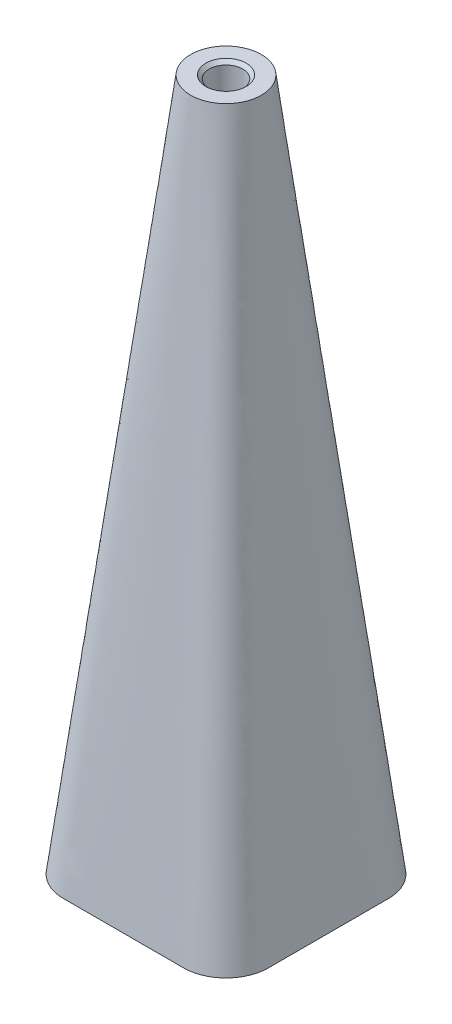
ISO-10303-21;
HEADER;
FILE_DESCRIPTION(('STEP AP214'),'2;1');
FILE_NAME('part.step','',(''),(''),'','','');
FILE_SCHEMA(('AUTOMOTIVE_DESIGN { 1 0 10303 214 1 1 1 1 }'));
ENDSEC;
DATA;
#1=APPLICATION_CONTEXT('core data for automotive mechanical design processes');
#2=APPLICATION_PROTOCOL_DEFINITION('international standard','automotive_design',2000,#1);
#3=PRODUCT_CONTEXT('',#1,'mechanical');
#4=PRODUCT('Part','Part','',(#3));
#5=PRODUCT_RELATED_PRODUCT_CATEGORY('part','',(#4));
#6=PRODUCT_DEFINITION_FORMATION('','',#4);
#7=PRODUCT_DEFINITION_CONTEXT('part definition',#1,'design');
#8=PRODUCT_DEFINITION('design','',#6,#7);
#9=PRODUCT_DEFINITION_SHAPE('','',#8);
#10=(LENGTH_UNIT() NAMED_UNIT(*) SI_UNIT(.MILLI.,.METRE.));
#11=(NAMED_UNIT(*) PLANE_ANGLE_UNIT() SI_UNIT($,.RADIAN.));
#12=(NAMED_UNIT(*) SI_UNIT($,.STERADIAN.) SOLID_ANGLE_UNIT());
#13=UNCERTAINTY_MEASURE_WITH_UNIT(LENGTH_MEASURE(1.E-05),#10,'distance_accuracy_value','');
#14=(GEOMETRIC_REPRESENTATION_CONTEXT(3) GLOBAL_UNCERTAINTY_ASSIGNED_CONTEXT((#13)) GLOBAL_UNIT_ASSIGNED_CONTEXT((#10,
#11,#12)) REPRESENTATION_CONTEXT('',''));
#15=CARTESIAN_POINT('',(0.,0.,0.));
#16=DIRECTION('',(0.,0.,1.));
#17=DIRECTION('',(1.,0.,0.));
#18=AXIS2_PLACEMENT_3D('',#15,#16,#17);
#19=CARTESIAN_POINT('',(23.0124,155.575,23.0124));
#20=DIRECTION('',(0.,1.,0.));
#21=DIRECTION('',(0.,0.,1.));
#22=AXIS2_PLACEMENT_3D('',#19,#20,#21);
#23=PLANE('',#22);
#24=CARTESIAN_POINT('',(23.0124,155.575,23.0124));
#25=DIRECTION('',(0.,1.,0.));
#26=DIRECTION('',(0.,0.,1.));
#27=AXIS2_PLACEMENT_3D('',#24,#25,#26);
#28=CIRCLE('',#27,4.54660000000002);
#29=CARTESIAN_POINT('',(23.0124,155.575,27.559));
#30=VERTEX_POINT('',#29);
#31=EDGE_CURVE('E432',#30,#30,#28,.F.);
#32=ORIENTED_EDGE('',*,*,#31,.T.);
#33=EDGE_LOOP('',(#32));
#34=FACE_BOUND('',#33,.T.);
#35=CARTESIAN_POINT('',(23.0124,155.575,23.0124));
#36=DIRECTION('',(0.,1.,0.));
#37=DIRECTION('',(0.,0.,1.));
#38=AXIS2_PLACEMENT_3D('',#35,#36,#37);
#39=CIRCLE('',#38,7.9375);
#40=CARTESIAN_POINT('',(23.0124,155.575,30.9499));
#41=VERTEX_POINT('',#40);
#42=EDGE_CURVE('E239',#41,#41,#39,.T.);
#43=ORIENTED_EDGE('',*,*,#42,.T.);
#44=EDGE_LOOP('',(#43));
#45=FACE_BOUND('',#44,.T.);
#46=ADVANCED_FACE('F188',(#34,#45),#23,.T.);
#47=CARTESIAN_POINT('',(9.525,0.,36.4998));
#48=DIRECTION('',(0.,1.,0.));
#49=DIRECTION('',(0.,0.,1.));
#50=AXIS2_PLACEMENT_3D('',#47,#48,#49);
#51=PLANE('',#50);
#52=CARTESIAN_POINT('',(35.7124,0.,10.3124));
#53=DIRECTION('',(0.,1.,0.));
#54=DIRECTION('',(0.,0.,1.));
#55=AXIS2_PLACEMENT_3D('',#52,#53,#54);
#56=CIRCLE('',#55,4.44500000000003);
#57=CARTESIAN_POINT('',(35.7124,0.,14.7574));
#58=VERTEX_POINT('',#57);
#59=EDGE_CURVE('E465',#58,#58,#56,.T.);
#60=ORIENTED_EDGE('',*,*,#59,.T.);
#61=EDGE_LOOP('',(#60));
#62=FACE_BOUND('',#61,.T.);
#63=CARTESIAN_POINT('',(10.3124,0.,35.7124));
#64=DIRECTION('',(0.,1.,0.));
#65=DIRECTION('',(0.,0.,1.));
#66=AXIS2_PLACEMENT_3D('',#63,#64,#65);
#67=CIRCLE('',#66,4.44499999999999);
#68=CARTESIAN_POINT('',(10.3124,0.,40.1574));
#69=VERTEX_POINT('',#68);
#70=EDGE_CURVE('E462',#69,#69,#67,.T.);
#71=ORIENTED_EDGE('',*,*,#70,.T.);
#72=EDGE_LOOP('',(#71));
#73=FACE_BOUND('',#72,.T.);
#74=CARTESIAN_POINT('',(35.7124,0.,35.7124));
#75=DIRECTION('',(0.,1.,0.));
#76=DIRECTION('',(0.,0.,1.));
#77=AXIS2_PLACEMENT_3D('',#74,#75,#76);
#78=CIRCLE('',#77,4.44500000000002);
#79=CARTESIAN_POINT('',(35.7124,0.,40.1574));
#80=VERTEX_POINT('',#79);
#81=EDGE_CURVE('E459',#80,#80,#78,.T.);
#82=ORIENTED_EDGE('',*,*,#81,.T.);
#83=EDGE_LOOP('',(#82));
#84=FACE_BOUND('',#83,.T.);
#85=CARTESIAN_POINT('',(10.3124,0.,10.3124));
#86=DIRECTION('',(0.,1.,0.));
#87=DIRECTION('',(0.,0.,1.));
#88=AXIS2_PLACEMENT_3D('',#85,#86,#87);
#89=CIRCLE('',#88,4.44500000000003);
#90=CARTESIAN_POINT('',(10.3124,0.,14.7574));
#91=VERTEX_POINT('',#90);
#92=EDGE_CURVE('E456',#91,#91,#89,.T.);
#93=ORIENTED_EDGE('',*,*,#92,.T.);
#94=EDGE_LOOP('',(#93));
#95=FACE_BOUND('',#94,.T.);
#96=CARTESIAN_POINT('',(9.525,0.,36.4998));
#97=DIRECTION('',(0.,1.,0.));
#98=DIRECTION('',(0.,0.,1.));
#99=AXIS2_PLACEMENT_3D('',#96,#97,#98);
#100=CIRCLE('',#99,9.525);
#101=CARTESIAN_POINT('',(0.,0.,36.4998));
#102=VERTEX_POINT('',#101);
#103=CARTESIAN_POINT('',(9.525,0.,46.0248));
#104=VERTEX_POINT('',#103);
#105=EDGE_CURVE('E235',#102,#104,#100,.T.);
#106=ORIENTED_EDGE('',*,*,#105,.F.);
#107=DIRECTION('',(0.,0.,1.));
#108=VECTOR('',#107,1.);
#109=CARTESIAN_POINT('',(0.,0.,9.525));
#110=LINE('',#109,#108);
#111=CARTESIAN_POINT('',(0.,0.,9.525));
#112=VERTEX_POINT('',#111);
#113=EDGE_CURVE('E228',#112,#102,#110,.T.);
#114=ORIENTED_EDGE('',*,*,#113,.F.);
#115=CARTESIAN_POINT('',(9.525,0.,9.525));
#116=DIRECTION('',(0.,1.,0.));
#117=DIRECTION('',(0.,0.,1.));
#118=AXIS2_PLACEMENT_3D('',#115,#116,#117);
#119=CIRCLE('',#118,9.525);
#120=CARTESIAN_POINT('',(9.525,0.,0.));
#121=VERTEX_POINT('',#120);
#122=EDGE_CURVE('E232',#121,#112,#119,.T.);
#123=ORIENTED_EDGE('',*,*,#122,.F.);
#124=DIRECTION('',(-1.,0.,0.));
#125=VECTOR('',#124,1.);
#126=CARTESIAN_POINT('',(9.525,0.,0.));
#127=LINE('',#126,#125);
#128=CARTESIAN_POINT('',(36.4998,0.,0.));
#129=VERTEX_POINT('',#128);
#130=EDGE_CURVE('E247',#129,#121,#127,.T.);
#131=ORIENTED_EDGE('',*,*,#130,.F.);
#132=CARTESIAN_POINT('',(36.4998,0.,9.525));
#133=DIRECTION('',(0.,1.,0.));
#134=DIRECTION('',(0.,0.,-1.));
#135=AXIS2_PLACEMENT_3D('',#132,#133,#134);
#136=CIRCLE('',#135,9.525);
#137=CARTESIAN_POINT('',(46.0248,0.,9.525));
#138=VERTEX_POINT('',#137);
#139=EDGE_CURVE('E318',#138,#129,#136,.T.);
#140=ORIENTED_EDGE('',*,*,#139,.F.);
#141=DIRECTION('',(0.,0.,-1.));
#142=VECTOR('',#141,1.);
#143=CARTESIAN_POINT('',(46.0248,0.,9.525));
#144=LINE('',#143,#142);
#145=CARTESIAN_POINT('',(46.0248,0.,36.4998));
#146=VERTEX_POINT('',#145);
#147=EDGE_CURVE('E319',#146,#138,#144,.T.);
#148=ORIENTED_EDGE('',*,*,#147,.F.);
#149=CARTESIAN_POINT('',(36.4998,0.,36.4998));
#150=DIRECTION('',(0.,1.,0.));
#151=DIRECTION('',(0.,0.,1.));
#152=AXIS2_PLACEMENT_3D('',#149,#150,#151);
#153=CIRCLE('',#152,9.525);
#154=CARTESIAN_POINT('',(36.4998,0.,46.0248));
#155=VERTEX_POINT('',#154);
#156=EDGE_CURVE('E210',#155,#146,#153,.T.);
#157=ORIENTED_EDGE('',*,*,#156,.F.);
#158=DIRECTION('',(1.,0.,0.));
#159=VECTOR('',#158,1.);
#160=CARTESIAN_POINT('',(9.525,0.,46.0248));
#161=LINE('',#160,#159);
#162=EDGE_CURVE('E204',#104,#155,#161,.T.);
#163=ORIENTED_EDGE('',*,*,#162,.F.);
#164=EDGE_LOOP('',(#106,#114,#123,#131,#140,#148,#157,#163));
#165=FACE_BOUND('',#164,.T.);
#166=ADVANCED_FACE('F231',(#62,#73,#84,#95,#165),#51,.F.);
#167=CARTESIAN_POINT('',(0.,0.,9.52500000510907));
#168=CARTESIAN_POINT('',(16.1643937507591,155.575,18.9988334239535));
#169=CARTESIAN_POINT('',(0.,0.,11.8283890018767));
#170=CARTESIAN_POINT('',(15.8181164259378,155.575,19.5896568821232));
#171=CARTESIAN_POINT('',(0.,0.,16.3489691387721));
#172=CARTESIAN_POINT('',(15.2676157821735,155.575,20.8829331204217));
#173=CARTESIAN_POINT('',(0.,0.,23.0124));
#174=CARTESIAN_POINT('',(14.9783470474869,155.575,23.0124));
#175=CARTESIAN_POINT('',(0.,0.,29.6758308612279));
#176=CARTESIAN_POINT('',(15.2676157821735,155.575,25.1418668795783));
#177=CARTESIAN_POINT('',(0.,0.,34.1964109981233));
#178=CARTESIAN_POINT('',(15.8181164259378,155.575,26.4351431178768));
#179=CARTESIAN_POINT('',(0.,0.,37.6911305747652));
#180=CARTESIAN_POINT('',(16.343491057708,155.575,27.3315450319706));
#181=CARTESIAN_POINT('',(0.455170520960979,0.,40.1559588832989));
#182=CARTESIAN_POINT('',(16.728581505719,155.575,27.8960858980067));
#183=CARTESIAN_POINT('',(2.60283333428908,0.,43.4219666657108));
#184=CARTESIAN_POINT('',(17.3852867076177,155.575,28.6395132923823));
#185=CARTESIAN_POINT('',(5.86884111670125,0.,45.5696294790391));
#186=CARTESIAN_POINT('',(18.1287141019933,155.575,29.296218494281));
#187=CARTESIAN_POINT('',(8.33366942523476,0.,46.0248));
#188=CARTESIAN_POINT('',(18.6932549680294,155.575,29.681308942292));
#189=CARTESIAN_POINT('',(11.8283890018767,0.,46.0248));
#190=CARTESIAN_POINT('',(19.5896568821232,155.575,30.2066835740622));
#191=CARTESIAN_POINT('',(16.3489691387721,0.,46.0247999999999));
#192=CARTESIAN_POINT('',(20.8829331204217,155.575,30.7571842178265));
#193=CARTESIAN_POINT('',(23.0124,0.,46.0248));
#194=CARTESIAN_POINT('',(23.0124,155.575,31.0464529525131));
#195=CARTESIAN_POINT('',(29.6758308612279,0.,46.0248));
#196=CARTESIAN_POINT('',(25.1418668795783,155.575,30.7571842178265));
#197=CARTESIAN_POINT('',(34.1964109981233,0.,46.0248));
#198=CARTESIAN_POINT('',(26.4351431178768,155.575,30.2066835740622));
#199=CARTESIAN_POINT('',(37.6911305747652,0.,46.0248));
#200=CARTESIAN_POINT('',(27.3315450319706,155.575,29.681308942292));
#201=CARTESIAN_POINT('',(40.1559588832987,0.,45.569629479039));
#202=CARTESIAN_POINT('',(27.8960858980068,155.575,29.296218494281));
#203=CARTESIAN_POINT('',(43.421966665711,0.,43.421966665711));
#204=CARTESIAN_POINT('',(28.6395132923822,155.575,28.6395132923822));
#205=CARTESIAN_POINT('',(45.569629479039,0.,40.1559588832987));
#206=CARTESIAN_POINT('',(29.296218494281,155.575,27.8960858980068));
#207=CARTESIAN_POINT('',(46.0248,0.,37.6911305747652));
#208=CARTESIAN_POINT('',(29.681308942292,155.575,27.3315450319706));
#209=CARTESIAN_POINT('',(46.0248,0.,34.1964109981233));
#210=CARTESIAN_POINT('',(30.2066835740622,155.575,26.4351431178768));
#211=CARTESIAN_POINT('',(46.0248,0.,29.6758308612279));
#212=CARTESIAN_POINT('',(30.7571842178265,155.575,25.1418668795783));
#213=CARTESIAN_POINT('',(46.0248,0.,23.0124));
#214=CARTESIAN_POINT('',(31.0464529525131,155.575000000001,23.0124));
#215=CARTESIAN_POINT('',(46.0248,0.,16.3489691387721));
#216=CARTESIAN_POINT('',(30.7571842178265,155.574999999999,20.8829331204217));
#217=CARTESIAN_POINT('',(46.0248,0.,11.8283890018767));
#218=CARTESIAN_POINT('',(30.2066835740622,155.575,19.5896568821232));
#219=CARTESIAN_POINT('',(46.0248,0.,8.33366942523475));
#220=CARTESIAN_POINT('',(29.681308942292,155.575,18.6932549680294));
#221=CARTESIAN_POINT('',(45.569629479039,0.,5.86884111670126));
#222=CARTESIAN_POINT('',(29.296218494281,155.575,18.1287141019933));
#223=CARTESIAN_POINT('',(43.4219666657109,0.,2.60283333428909));
#224=CARTESIAN_POINT('',(28.6395132923822,155.575,17.3852867076177));
#225=CARTESIAN_POINT('',(40.1559588832987,0.,0.455170520960967));
#226=CARTESIAN_POINT('',(27.8960858980068,155.575,16.728581505719));
#227=CARTESIAN_POINT('',(37.6911305747652,0.,0.));
#228=CARTESIAN_POINT('',(27.3315450319706,155.575,16.343491057708));
#229=CARTESIAN_POINT('',(34.1964109981233,0.,0.));
#230=CARTESIAN_POINT('',(26.4351431178768,155.575,15.8181164259378));
#231=CARTESIAN_POINT('',(29.6758308612279,0.,0.));
#232=CARTESIAN_POINT('',(25.1418668795783,155.575,15.2676157821735));
#233=CARTESIAN_POINT('',(23.0124,0.,0.));
#234=CARTESIAN_POINT('',(23.0124,155.575,14.9783470474869));
#235=CARTESIAN_POINT('',(16.3489691387721,0.,0.));
#236=CARTESIAN_POINT('',(20.8829331204217,155.575,15.2676157821735));
#237=CARTESIAN_POINT('',(11.8283890018767,0.,0.));
#238=CARTESIAN_POINT('',(19.5896568821232,155.575,15.8181164259378));
#239=CARTESIAN_POINT('',(8.33366942523475,0.,0.));
#240=CARTESIAN_POINT('',(18.6932549680294,155.575,16.343491057708));
#241=CARTESIAN_POINT('',(5.86884111670127,0.,0.455170520960981));
#242=CARTESIAN_POINT('',(18.1287141019933,155.575,16.728581505719));
#243=CARTESIAN_POINT('',(2.60283333428907,0.,2.60283333428907));
#244=CARTESIAN_POINT('',(17.3852867076177,155.575,17.3852867076177));
#245=CARTESIAN_POINT('',(0.455170520960986,0.,5.86884111670126));
#246=CARTESIAN_POINT('',(16.728581505719,155.575,18.1287141019933));
#247=CARTESIAN_POINT('',(0.,0.,8.33366942523475));
#248=CARTESIAN_POINT('',(16.343491057708,155.575,18.6932549680294));
#249=CARTESIAN_POINT('',(0.,0.,9.52500000510907));
#250=CARTESIAN_POINT('',(16.1643937507591,155.575,18.9988334239535));
#251=B_SPLINE_SURFACE_WITH_KNOTS('',3,1,((#167,#168),(#169,#170),(#171,#172),(#173,#174),(#175,
#176),(#177,#178),(#179,#180),(#181,#182),(#183,#184),(#185,#186),(#187,#188),(#189,#190),(#191,
#192),(#193,#194),(#195,#196),(#197,#198),(#199,#200),(#201,#202),(#203,#204),(#205,#206),(#207,
#208),(#209,#210),(#211,#212),(#213,#214),(#215,#216),(#217,#218),(#219,#220),(#221,#222),(#223,
#224),(#225,#226),(#227,#228),(#229,#230),(#231,#232),(#233,#234),(#235,#236),(#237,#238),(#239,
#240),(#241,#242),(#243,#244),(#245,#246),(#247,#248),(#249,#250)),.UNSPECIFIED.,.T.,.F.,.F.,(4,
1,1,1,2,1,1,1,2,1,1,1,2,1,1,1,2,1,1,1,2,1,1,1,2,1,1,1,2,1,1,1,4),(2,2),(0.,0.0411940955892971,
0.0823881911785941,0.123582286767891,0.164776382357188,0.186082286767891,0.207388191178594,
0.228694095589297,0.25,0.291194095589297,0.332388191178594,0.373582286767891,0.414776382357188,
0.436082286767891,0.457388191178594,0.478694095589297,0.5,0.541194095589297,0.582388191178594,
0.623582286767891,0.664776382357188,0.686082286767891,0.707388191178594,0.728694095589297,0.75,
0.791194095589297,0.832388191178594,0.873582286767891,0.914776382357188,0.936082286767891,
0.957388191178594,0.978694095589297,1.),(0.,1.),.UNSPECIFIED.);
#252=ORIENTED_EDGE('',*,*,#113,.T.);
#253=ORIENTED_EDGE('',*,*,#105,.T.);
#254=ORIENTED_EDGE('',*,*,#162,.T.);
#255=ORIENTED_EDGE('',*,*,#156,.T.);
#256=ORIENTED_EDGE('',*,*,#147,.T.);
#257=ORIENTED_EDGE('',*,*,#139,.T.);
#258=ORIENTED_EDGE('',*,*,#130,.T.);
#259=ORIENTED_EDGE('',*,*,#122,.T.);
#260=EDGE_LOOP('',(#252,#253,#254,#255,#256,#257,#258,#259));
#261=FACE_BOUND('',#260,.T.);
#262=ORIENTED_EDGE('',*,*,#42,.F.);
#263=EDGE_LOOP('',(#262));
#264=FACE_BOUND('',#263,.T.);
#265=ADVANCED_FACE('F244',(#261,#264),#251,.T.);
#266=CARTESIAN_POINT('',(23.0124,148.209,23.0124));
#267=DIRECTION('',(0.,1.,0.));
#268=DIRECTION('',(0.,0.,1.));
#269=AXIS2_PLACEMENT_3D('',#266,#267,#268);
#270=CYLINDRICAL_SURFACE('',#269,3.7846);
#271=CARTESIAN_POINT('',(23.0124,154.813,23.0124));
#272=DIRECTION('',(0.,1.,0.));
#273=DIRECTION('',(0.,0.,1.));
#274=AXIS2_PLACEMENT_3D('',#271,#272,#273);
#275=CIRCLE('',#274,3.7846);
#276=CARTESIAN_POINT('',(23.0124,154.813,26.797));
#277=VERTEX_POINT('',#276);
#278=EDGE_CURVE('E468',#277,#277,#275,.T.);
#279=ORIENTED_EDGE('',*,*,#278,.T.);
#280=EDGE_LOOP('',(#279));
#281=FACE_BOUND('',#280,.T.);
#282=CARTESIAN_POINT('',(23.0124,148.209,23.0124));
#283=DIRECTION('',(0.,1.,0.));
#284=DIRECTION('',(0.,0.,1.));
#285=AXIS2_PLACEMENT_3D('',#282,#283,#284);
#286=CIRCLE('',#285,3.7846);
#287=CARTESIAN_POINT('',(23.0124,148.209,26.797));
#288=VERTEX_POINT('',#287);
#289=EDGE_CURVE('E349',#288,#288,#286,.T.);
#290=ORIENTED_EDGE('',*,*,#289,.F.);
#291=EDGE_LOOP('',(#290));
#292=FACE_BOUND('',#291,.T.);
#293=ADVANCED_FACE('F271',(#281,#292),#270,.F.);
#294=CARTESIAN_POINT('',(23.0124,148.209,23.0124));
#295=DIRECTION('',(0.,1.,0.));
#296=DIRECTION('',(0.,0.,1.));
#297=AXIS2_PLACEMENT_3D('',#294,#295,#296);
#298=PLANE('',#297);
#299=CARTESIAN_POINT('',(23.0124,148.209,23.0124));
#300=DIRECTION('',(0.,1.,0.));
#301=DIRECTION('',(0.,0.,1.));
#302=AXIS2_PLACEMENT_3D('',#299,#300,#301);
#303=CIRCLE('',#302,3.175);
#304=CARTESIAN_POINT('',(23.0124,148.209,26.1874));
#305=VERTEX_POINT('',#304);
#306=EDGE_CURVE('E358',#305,#305,#303,.T.);
#307=ORIENTED_EDGE('',*,*,#306,.F.);
#308=EDGE_LOOP('',(#307));
#309=FACE_BOUND('',#308,.T.);
#310=ORIENTED_EDGE('',*,*,#289,.T.);
#311=EDGE_LOOP('',(#310));
#312=FACE_BOUND('',#311,.T.);
#313=ADVANCED_FACE('F591',(#309,#312),#298,.T.);
#314=CARTESIAN_POINT('',(23.0124,122.809,23.0124));
#315=DIRECTION('',(0.,1.,0.));
#316=DIRECTION('',(0.,0.,1.));
#317=AXIS2_PLACEMENT_3D('',#314,#315,#316);
#318=CYLINDRICAL_SURFACE('',#317,3.175);
#319=CARTESIAN_POINT('',(23.0124,122.809,23.0124));
#320=DIRECTION('',(0.,1.,0.));
#321=DIRECTION('',(0.,0.,1.));
#322=AXIS2_PLACEMENT_3D('',#319,#320,#321);
#323=CIRCLE('',#322,3.175);
#324=CARTESIAN_POINT('',(23.0124,122.809,26.1874));
#325=VERTEX_POINT('',#324);
#326=EDGE_CURVE('E353',#325,#325,#323,.T.);
#327=ORIENTED_EDGE('',*,*,#326,.F.);
#328=EDGE_LOOP('',(#327));
#329=FACE_BOUND('',#328,.T.);
#330=ORIENTED_EDGE('',*,*,#306,.T.);
#331=EDGE_LOOP('',(#330));
#332=FACE_BOUND('',#331,.T.);
#333=ADVANCED_FACE('F587',(#329,#332),#318,.F.);
#334=CARTESIAN_POINT('',(23.0124,122.809,23.0124));
#335=DIRECTION('',(0.,1.,0.));
#336=DIRECTION('',(0.,0.,1.));
#337=AXIS2_PLACEMENT_3D('',#334,#335,#336);
#338=PLANE('',#337);
#339=ORIENTED_EDGE('',*,*,#326,.T.);
#340=EDGE_LOOP('',(#339));
#341=FACE_BOUND('',#340,.T.);
#342=ADVANCED_FACE('F418',(#341),#338,.T.);
#343=CARTESIAN_POINT('',(35.7124,8.89,10.3124));
#344=DIRECTION('',(0.,-1.,0.));
#345=DIRECTION('',(0.,0.,-1.));
#346=AXIS2_PLACEMENT_3D('',#343,#344,#345);
#347=CYLINDRICAL_SURFACE('',#346,3.683);
#348=CARTESIAN_POINT('',(35.7124,0.762000000000032,10.3124));
#349=DIRECTION('',(0.,1.,0.));
#350=DIRECTION('',(0.,0.,1.));
#351=AXIS2_PLACEMENT_3D('',#348,#349,#350);
#352=CIRCLE('',#351,3.683);
#353=CARTESIAN_POINT('',(35.7124,0.762000000000032,13.9954));
#354=VERTEX_POINT('',#353);
#355=EDGE_CURVE('E453',#354,#354,#352,.F.);
#356=ORIENTED_EDGE('',*,*,#355,.T.);
#357=EDGE_LOOP('',(#356));
#358=FACE_BOUND('',#357,.T.);
#359=CARTESIAN_POINT('',(35.7124,8.12799999999999,10.3124));
#360=DIRECTION('',(0.,-1.,0.));
#361=DIRECTION('',(0.,0.,-1.));
#362=AXIS2_PLACEMENT_3D('',#359,#360,#361);
#363=CIRCLE('',#362,3.683);
#364=CARTESIAN_POINT('',(35.7124,8.12799999999999,6.62940000000001));
#365=VERTEX_POINT('',#364);
#366=EDGE_CURVE('E435',#365,#365,#363,.F.);
#367=ORIENTED_EDGE('',*,*,#366,.T.);
#368=EDGE_LOOP('',(#367));
#369=FACE_BOUND('',#368,.T.);
#370=ADVANCED_FACE('F412',(#358,#369),#347,.F.);
#371=CARTESIAN_POINT('',(10.3124,8.89,10.3124));
#372=DIRECTION('',(0.,-1.,0.));
#373=DIRECTION('',(0.,0.,-1.));
#374=AXIS2_PLACEMENT_3D('',#371,#372,#373);
#375=CYLINDRICAL_SURFACE('',#374,3.683);
#376=CARTESIAN_POINT('',(10.3124,0.762000000000027,10.3124));
#377=DIRECTION('',(0.,1.,0.));
#378=DIRECTION('',(0.,0.,1.));
#379=AXIS2_PLACEMENT_3D('',#376,#377,#378);
#380=CIRCLE('',#379,3.683);
#381=CARTESIAN_POINT('',(10.3124,0.762000000000027,13.9954));
#382=VERTEX_POINT('',#381);
#383=EDGE_CURVE('E197',#382,#382,#380,.F.);
#384=ORIENTED_EDGE('',*,*,#383,.T.);
#385=EDGE_LOOP('',(#384));
#386=FACE_BOUND('',#385,.T.);
#387=CARTESIAN_POINT('',(10.3124,8.89,10.3124));
#388=DIRECTION('',(0.,-1.,0.));
#389=DIRECTION('',(0.,0.,-1.));
#390=AXIS2_PLACEMENT_3D('',#387,#388,#389);
#391=CIRCLE('',#390,3.683);
#392=CARTESIAN_POINT('',(10.3124,8.89,6.6294));
#393=VERTEX_POINT('',#392);
#394=EDGE_CURVE('E362',#393,#393,#391,.T.);
#395=ORIENTED_EDGE('',*,*,#394,.F.);
#396=EDGE_LOOP('',(#395));
#397=FACE_BOUND('',#396,.T.);
#398=ADVANCED_FACE('F407',(#386,#397),#375,.F.);
#399=CARTESIAN_POINT('',(10.3124,8.89,10.3124));
#400=DIRECTION('',(0.,-1.,0.));
#401=DIRECTION('',(0.,0.,-1.));
#402=AXIS2_PLACEMENT_3D('',#399,#400,#401);
#403=PLANE('',#402);
#404=CARTESIAN_POINT('',(10.3124,8.89,10.3124));
#405=DIRECTION('',(0.,-1.,0.));
#406=DIRECTION('',(0.,0.,-1.));
#407=AXIS2_PLACEMENT_3D('',#404,#405,#406);
#408=CIRCLE('',#407,3.175);
#409=CARTESIAN_POINT('',(10.3124,8.89,7.13740000000001));
#410=VERTEX_POINT('',#409);
#411=EDGE_CURVE('E388',#410,#410,#408,.T.);
#412=ORIENTED_EDGE('',*,*,#411,.F.);
#413=EDGE_LOOP('',(#412));
#414=FACE_BOUND('',#413,.T.);
#415=ORIENTED_EDGE('',*,*,#394,.T.);
#416=EDGE_LOOP('',(#415));
#417=FACE_BOUND('',#416,.T.);
#418=ADVANCED_FACE('F403',(#414,#417),#403,.T.);
#419=CARTESIAN_POINT('',(10.3124,8.89,35.7124));
#420=DIRECTION('',(0.,-1.,0.));
#421=DIRECTION('',(0.,0.,-1.));
#422=AXIS2_PLACEMENT_3D('',#419,#420,#421);
#423=CYLINDRICAL_SURFACE('',#422,3.683);
#424=CARTESIAN_POINT('',(10.3124,0.761999999999985,35.7124));
#425=DIRECTION('',(0.,1.,0.));
#426=DIRECTION('',(0.,0.,1.));
#427=AXIS2_PLACEMENT_3D('',#424,#425,#426);
#428=CIRCLE('',#427,3.683);
#429=CARTESIAN_POINT('',(10.3124,0.761999999999985,39.3954));
#430=VERTEX_POINT('',#429);
#431=EDGE_CURVE('E472',#430,#430,#428,.F.);
#432=ORIENTED_EDGE('',*,*,#431,.T.);
#433=EDGE_LOOP('',(#432));
#434=FACE_BOUND('',#433,.T.);
#435=CARTESIAN_POINT('',(10.3124,8.89,35.7124));
#436=DIRECTION('',(0.,-1.,0.));
#437=DIRECTION('',(0.,0.,-1.));
#438=AXIS2_PLACEMENT_3D('',#435,#436,#437);
#439=CIRCLE('',#438,3.683);
#440=CARTESIAN_POINT('',(10.3124,8.89,32.0294));
#441=VERTEX_POINT('',#440);
#442=EDGE_CURVE('E367',#441,#441,#439,.T.);
#443=ORIENTED_EDGE('',*,*,#442,.F.);
#444=EDGE_LOOP('',(#443));
#445=FACE_BOUND('',#444,.T.);
#446=ADVANCED_FACE('F406',(#434,#445),#423,.F.);
#447=CARTESIAN_POINT('',(10.3124,8.89,35.7124));
#448=DIRECTION('',(0.,-1.,0.));
#449=DIRECTION('',(0.,0.,-1.));
#450=AXIS2_PLACEMENT_3D('',#447,#448,#449);
#451=PLANE('',#450);
#452=CARTESIAN_POINT('',(10.3124,8.89,35.7124));
#453=DIRECTION('',(0.,-1.,0.));
#454=DIRECTION('',(0.,0.,-1.));
#455=AXIS2_PLACEMENT_3D('',#452,#453,#454);
#456=CIRCLE('',#455,3.175);
#457=CARTESIAN_POINT('',(10.3124,8.89,32.5374));
#458=VERTEX_POINT('',#457);
#459=EDGE_CURVE('E382',#458,#458,#456,.T.);
#460=ORIENTED_EDGE('',*,*,#459,.F.);
#461=EDGE_LOOP('',(#460));
#462=FACE_BOUND('',#461,.T.);
#463=ORIENTED_EDGE('',*,*,#442,.T.);
#464=EDGE_LOOP('',(#463));
#465=FACE_BOUND('',#464,.T.);
#466=ADVANCED_FACE('F567',(#462,#465),#451,.T.);
#467=CARTESIAN_POINT('',(35.7124,8.89,35.7124));
#468=DIRECTION('',(0.,-1.,0.));
#469=DIRECTION('',(0.,0.,-1.));
#470=AXIS2_PLACEMENT_3D('',#467,#468,#469);
#471=CYLINDRICAL_SURFACE('',#470,3.683);
#472=CARTESIAN_POINT('',(35.7124,0.762000000000004,35.7124));
#473=DIRECTION('',(0.,1.,0.));
#474=DIRECTION('',(0.,0.,1.));
#475=AXIS2_PLACEMENT_3D('',#472,#473,#474);
#476=CIRCLE('',#475,3.683);
#477=CARTESIAN_POINT('',(35.7124,0.762000000000004,39.3954));
#478=VERTEX_POINT('',#477);
#479=EDGE_CURVE('E475',#478,#478,#476,.F.);
#480=ORIENTED_EDGE('',*,*,#479,.T.);
#481=EDGE_LOOP('',(#480));
#482=FACE_BOUND('',#481,.T.);
#483=CARTESIAN_POINT('',(35.7124,8.89,35.7124));
#484=DIRECTION('',(0.,-1.,0.));
#485=DIRECTION('',(0.,0.,-1.));
#486=AXIS2_PLACEMENT_3D('',#483,#484,#485);
#487=CIRCLE('',#486,3.683);
#488=CARTESIAN_POINT('',(35.7124,8.89,32.0294));
#489=VERTEX_POINT('',#488);
#490=EDGE_CURVE('E364',#489,#489,#487,.T.);
#491=ORIENTED_EDGE('',*,*,#490,.F.);
#492=EDGE_LOOP('',(#491));
#493=FACE_BOUND('',#492,.T.);
#494=ADVANCED_FACE('F570',(#482,#493),#471,.F.);
#495=CARTESIAN_POINT('',(35.7124,8.89,35.7124));
#496=DIRECTION('',(0.,-1.,0.));
#497=DIRECTION('',(0.,0.,-1.));
#498=AXIS2_PLACEMENT_3D('',#495,#496,#497);
#499=PLANE('',#498);
#500=CARTESIAN_POINT('',(35.7124,8.89,35.7124));
#501=DIRECTION('',(0.,-1.,0.));
#502=DIRECTION('',(0.,0.,-1.));
#503=AXIS2_PLACEMENT_3D('',#500,#501,#502);
#504=CIRCLE('',#503,3.175);
#505=CARTESIAN_POINT('',(35.7124,8.89,32.5374));
#506=VERTEX_POINT('',#505);
#507=EDGE_CURVE('E376',#506,#506,#504,.T.);
#508=ORIENTED_EDGE('',*,*,#507,.F.);
#509=EDGE_LOOP('',(#508));
#510=FACE_BOUND('',#509,.T.);
#511=ORIENTED_EDGE('',*,*,#490,.T.);
#512=EDGE_LOOP('',(#511));
#513=FACE_BOUND('',#512,.T.);
#514=ADVANCED_FACE('F550',(#510,#513),#499,.T.);
#515=CARTESIAN_POINT('',(35.7124,34.29,35.7124));
#516=DIRECTION('',(0.,-1.,0.));
#517=DIRECTION('',(0.,0.,-1.));
#518=AXIS2_PLACEMENT_3D('',#515,#516,#517);
#519=CYLINDRICAL_SURFACE('',#518,3.175);
#520=CARTESIAN_POINT('',(35.7124,34.29,35.7124));
#521=DIRECTION('',(0.,-1.,0.));
#522=DIRECTION('',(0.,0.,-1.));
#523=AXIS2_PLACEMENT_3D('',#520,#521,#522);
#524=CIRCLE('',#523,3.175);
#525=CARTESIAN_POINT('',(35.7124,34.29,32.5374));
#526=VERTEX_POINT('',#525);
#527=EDGE_CURVE('E379',#526,#526,#524,.T.);
#528=ORIENTED_EDGE('',*,*,#527,.F.);
#529=EDGE_LOOP('',(#528));
#530=FACE_BOUND('',#529,.T.);
#531=ORIENTED_EDGE('',*,*,#507,.T.);
#532=EDGE_LOOP('',(#531));
#533=FACE_BOUND('',#532,.T.);
#534=ADVANCED_FACE('F546',(#530,#533),#519,.F.);
#535=CARTESIAN_POINT('',(35.7124,34.29,35.7124));
#536=DIRECTION('',(0.,-1.,0.));
#537=DIRECTION('',(0.,0.,-1.));
#538=AXIS2_PLACEMENT_3D('',#535,#536,#537);
#539=PLANE('',#538);
#540=ORIENTED_EDGE('',*,*,#527,.T.);
#541=EDGE_LOOP('',(#540));
#542=FACE_BOUND('',#541,.T.);
#543=ADVANCED_FACE('F549',(#542),#539,.T.);
#544=CARTESIAN_POINT('',(10.3124,34.29,35.7124));
#545=DIRECTION('',(0.,-1.,0.));
#546=DIRECTION('',(0.,0.,-1.));
#547=AXIS2_PLACEMENT_3D('',#544,#545,#546);
#548=CYLINDRICAL_SURFACE('',#547,3.175);
#549=CARTESIAN_POINT('',(10.3124,34.29,35.7124));
#550=DIRECTION('',(0.,-1.,0.));
#551=DIRECTION('',(0.,0.,-1.));
#552=AXIS2_PLACEMENT_3D('',#549,#550,#551);
#553=CIRCLE('',#552,3.175);
#554=CARTESIAN_POINT('',(10.3124,34.29,32.5374));
#555=VERTEX_POINT('',#554);
#556=EDGE_CURVE('E385',#555,#555,#553,.T.);
#557=ORIENTED_EDGE('',*,*,#556,.F.);
#558=EDGE_LOOP('',(#557));
#559=FACE_BOUND('',#558,.T.);
#560=ORIENTED_EDGE('',*,*,#459,.T.);
#561=EDGE_LOOP('',(#560));
#562=FACE_BOUND('',#561,.T.);
#563=ADVANCED_FACE('F554',(#559,#562),#548,.F.);
#564=CARTESIAN_POINT('',(10.3124,34.29,35.7124));
#565=DIRECTION('',(0.,-1.,0.));
#566=DIRECTION('',(0.,0.,-1.));
#567=AXIS2_PLACEMENT_3D('',#564,#565,#566);
#568=PLANE('',#567);
#569=ORIENTED_EDGE('',*,*,#556,.T.);
#570=EDGE_LOOP('',(#569));
#571=FACE_BOUND('',#570,.T.);
#572=ADVANCED_FACE('F399',(#571),#568,.T.);
#573=CARTESIAN_POINT('',(10.3124,34.29,10.3124));
#574=DIRECTION('',(0.,-1.,0.));
#575=DIRECTION('',(0.,0.,-1.));
#576=AXIS2_PLACEMENT_3D('',#573,#574,#575);
#577=CYLINDRICAL_SURFACE('',#576,3.175);
#578=CARTESIAN_POINT('',(10.3124,34.29,10.3124));
#579=DIRECTION('',(0.,-1.,0.));
#580=DIRECTION('',(0.,0.,-1.));
#581=AXIS2_PLACEMENT_3D('',#578,#579,#580);
#582=CIRCLE('',#581,3.175);
#583=CARTESIAN_POINT('',(10.3124,34.29,7.13740000000001));
#584=VERTEX_POINT('',#583);
#585=EDGE_CURVE('E375',#584,#584,#582,.T.);
#586=ORIENTED_EDGE('',*,*,#585,.F.);
#587=EDGE_LOOP('',(#586));
#588=FACE_BOUND('',#587,.T.);
#589=ORIENTED_EDGE('',*,*,#411,.T.);
#590=EDGE_LOOP('',(#589));
#591=FACE_BOUND('',#590,.T.);
#592=ADVANCED_FACE('F396',(#588,#591),#577,.F.);
#593=CARTESIAN_POINT('',(10.3124,34.29,10.3124));
#594=DIRECTION('',(0.,-1.,0.));
#595=DIRECTION('',(0.,0.,-1.));
#596=AXIS2_PLACEMENT_3D('',#593,#594,#595);
#597=PLANE('',#596);
#598=ORIENTED_EDGE('',*,*,#585,.T.);
#599=EDGE_LOOP('',(#598));
#600=FACE_BOUND('',#599,.T.);
#601=ADVANCED_FACE('F394',(#600),#597,.T.);
#602=CARTESIAN_POINT('',(35.7124,34.29,10.3124));
#603=DIRECTION('',(0.,-1.,0.));
#604=DIRECTION('',(0.,0.,-1.));
#605=AXIS2_PLACEMENT_3D('',#602,#603,#604);
#606=CYLINDRICAL_SURFACE('',#605,3.175);
#607=CARTESIAN_POINT('',(35.7124,8.63599999999999,10.3124));
#608=DIRECTION('',(0.,-1.,0.));
#609=DIRECTION('',(0.,0.,-1.));
#610=AXIS2_PLACEMENT_3D('',#607,#608,#609);
#611=CIRCLE('',#610,3.175);
#612=CARTESIAN_POINT('',(35.7124,8.63599999999999,7.13740000000001));
#613=VERTEX_POINT('',#612);
#614=EDGE_CURVE('E12',#613,#613,#611,.T.);
#615=ORIENTED_EDGE('',*,*,#614,.T.);
#616=EDGE_LOOP('',(#615));
#617=FACE_BOUND('',#616,.T.);
#618=CARTESIAN_POINT('',(35.7124,34.29,10.3124));
#619=DIRECTION('',(0.,-1.,0.));
#620=DIRECTION('',(0.,0.,-1.));
#621=AXIS2_PLACEMENT_3D('',#618,#619,#620);
#622=CIRCLE('',#621,3.175);
#623=CARTESIAN_POINT('',(35.7124,34.29,7.13740000000001));
#624=VERTEX_POINT('',#623);
#625=EDGE_CURVE('E368',#624,#624,#622,.T.);
#626=ORIENTED_EDGE('',*,*,#625,.F.);
#627=EDGE_LOOP('',(#626));
#628=FACE_BOUND('',#627,.T.);
#629=ADVANCED_FACE('F526',(#617,#628),#606,.F.);
#630=CARTESIAN_POINT('',(35.7124,34.29,10.3124));
#631=DIRECTION('',(0.,-1.,0.));
#632=DIRECTION('',(0.,0.,-1.));
#633=AXIS2_PLACEMENT_3D('',#630,#631,#632);
#634=PLANE('',#633);
#635=ORIENTED_EDGE('',*,*,#625,.T.);
#636=EDGE_LOOP('',(#635));
#637=FACE_BOUND('',#636,.T.);
#638=ADVANCED_FACE('F521',(#637),#634,.T.);
#639=CARTESIAN_POINT('',(35.7124,0.762000000000032,10.3124));
#640=DIRECTION('',(0.,-1.,0.));
#641=DIRECTION('',(0.,0.,-1.));
#642=AXIS2_PLACEMENT_3D('',#639,#640,#641);
#643=CONICAL_SURFACE('',#642,3.683,0.785398163397449);
#644=ORIENTED_EDGE('',*,*,#59,.F.);
#645=EDGE_LOOP('',(#644));
#646=FACE_BOUND('',#645,.T.);
#647=ORIENTED_EDGE('',*,*,#355,.F.);
#648=EDGE_LOOP('',(#647));
#649=FACE_BOUND('',#648,.T.);
#650=ADVANCED_FACE('F516',(#646,#649),#643,.F.);
#651=CARTESIAN_POINT('',(35.7124,8.89,10.3124));
#652=DIRECTION('',(0.,-1.,0.));
#653=DIRECTION('',(0.,0.,-1.));
#654=AXIS2_PLACEMENT_3D('',#651,#652,#653);
#655=CONICAL_SURFACE('',#654,2.92099999999999,0.785398163397453);
#656=ORIENTED_EDGE('',*,*,#366,.F.);
#657=EDGE_LOOP('',(#656));
#658=FACE_BOUND('',#657,.T.);
#659=ORIENTED_EDGE('',*,*,#614,.F.);
#660=EDGE_LOOP('',(#659));
#661=FACE_BOUND('',#660,.T.);
#662=ADVANCED_FACE('F510',(#658,#661),#655,.F.);
#663=CARTESIAN_POINT('',(23.0124,154.813,23.0124));
#664=DIRECTION('',(0.,1.,0.));
#665=DIRECTION('',(0.,0.,1.));
#666=AXIS2_PLACEMENT_3D('',#663,#664,#665);
#667=CONICAL_SURFACE('',#666,3.7846,0.785398163397436);
#668=ORIENTED_EDGE('',*,*,#31,.F.);
#669=EDGE_LOOP('',(#668));
#670=FACE_BOUND('',#669,.T.);
#671=ORIENTED_EDGE('',*,*,#278,.F.);
#672=EDGE_LOOP('',(#671));
#673=FACE_BOUND('',#672,.T.);
#674=ADVANCED_FACE('F492',(#670,#673),#667,.F.);
#675=CARTESIAN_POINT('',(10.3124,0.761999999999985,35.7124));
#676=DIRECTION('',(0.,-1.,0.));
#677=DIRECTION('',(0.,0.,-1.));
#678=AXIS2_PLACEMENT_3D('',#675,#676,#677);
#679=CONICAL_SURFACE('',#678,3.683,0.78539816339745);
#680=ORIENTED_EDGE('',*,*,#70,.F.);
#681=EDGE_LOOP('',(#680));
#682=FACE_BOUND('',#681,.T.);
#683=ORIENTED_EDGE('',*,*,#431,.F.);
#684=EDGE_LOOP('',(#683));
#685=FACE_BOUND('',#684,.T.);
#686=ADVANCED_FACE('F485',(#682,#685),#679,.F.);
#687=CARTESIAN_POINT('',(35.7124,0.762000000000004,35.7124));
#688=DIRECTION('',(0.,-1.,0.));
#689=DIRECTION('',(0.,0.,-1.));
#690=AXIS2_PLACEMENT_3D('',#687,#688,#689);
#691=CONICAL_SURFACE('',#690,3.683,0.785398163397458);
#692=ORIENTED_EDGE('',*,*,#81,.F.);
#693=EDGE_LOOP('',(#692));
#694=FACE_BOUND('',#693,.T.);
#695=ORIENTED_EDGE('',*,*,#479,.F.);
#696=EDGE_LOOP('',(#695));
#697=FACE_BOUND('',#696,.T.);
#698=ADVANCED_FACE('F480',(#694,#697),#691,.F.);
#699=CARTESIAN_POINT('',(10.3124,0.762000000000027,10.3124));
#700=DIRECTION('',(0.,-1.,0.));
#701=DIRECTION('',(0.,0.,-1.));
#702=AXIS2_PLACEMENT_3D('',#699,#700,#701);
#703=CONICAL_SURFACE('',#702,3.683,0.78539816339745);
#704=ORIENTED_EDGE('',*,*,#92,.F.);
#705=EDGE_LOOP('',(#704));
#706=FACE_BOUND('',#705,.T.);
#707=ORIENTED_EDGE('',*,*,#383,.F.);
#708=EDGE_LOOP('',(#707));
#709=FACE_BOUND('',#708,.T.);
#710=ADVANCED_FACE('F191',(#706,#709),#703,.F.);
#711=CLOSED_SHELL('',(#46,#166,#265,#293,#313,#333,#342,#370,#398,#418,#446,#466,#494,#514,#534,
#543,#563,#572,#592,#601,#629,#638,#650,#662,#674,#686,#698,#710));
#712=MANIFOLD_SOLID_BREP('B2',#711);
#713=ADVANCED_BREP_SHAPE_REPRESENTATION('',(#18,#712),#14);
#714=SHAPE_DEFINITION_REPRESENTATION(#9,#713);
ENDSEC;
END-ISO-10303-21;
